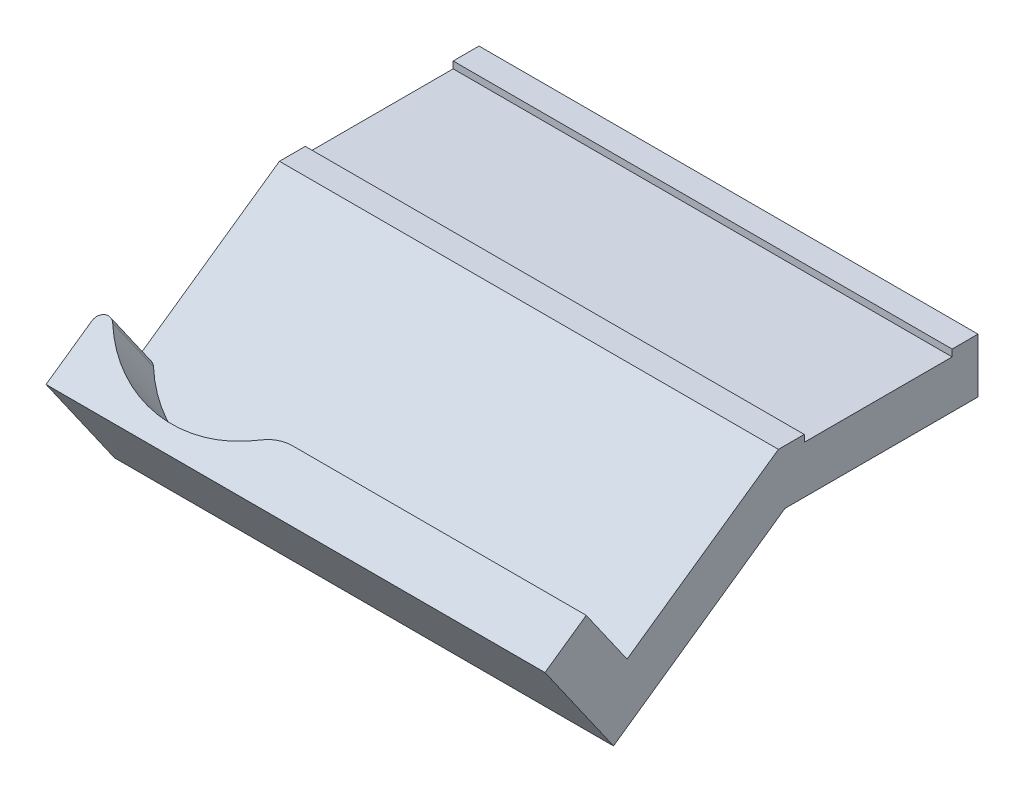
ISO-10303-21;
HEADER;
FILE_DESCRIPTION(('STEP AP214'),'2;1');
FILE_NAME('part.step','',(''),(''),'','','');
FILE_SCHEMA(('AUTOMOTIVE_DESIGN { 1 0 10303 214 1 1 1 1 }'));
ENDSEC;
DATA;
#1=APPLICATION_CONTEXT('core data for automotive mechanical design processes');
#2=APPLICATION_PROTOCOL_DEFINITION('international standard','automotive_design',2000,#1);
#3=PRODUCT_CONTEXT('',#1,'mechanical');
#4=PRODUCT('Part','Part','',(#3));
#5=PRODUCT_RELATED_PRODUCT_CATEGORY('part','',(#4));
#6=PRODUCT_DEFINITION_FORMATION('','',#4);
#7=PRODUCT_DEFINITION_CONTEXT('part definition',#1,'design');
#8=PRODUCT_DEFINITION('design','',#6,#7);
#9=PRODUCT_DEFINITION_SHAPE('','',#8);
#10=(LENGTH_UNIT() NAMED_UNIT(*) SI_UNIT(.MILLI.,.METRE.));
#11=(NAMED_UNIT(*) PLANE_ANGLE_UNIT() SI_UNIT($,.RADIAN.));
#12=(NAMED_UNIT(*) SI_UNIT($,.STERADIAN.) SOLID_ANGLE_UNIT());
#13=UNCERTAINTY_MEASURE_WITH_UNIT(LENGTH_MEASURE(1.E-05),#10,'distance_accuracy_value','');
#14=(GEOMETRIC_REPRESENTATION_CONTEXT(3) GLOBAL_UNCERTAINTY_ASSIGNED_CONTEXT((#13)) GLOBAL_UNIT_ASSIGNED_CONTEXT((#10,
#11,#12)) REPRESENTATION_CONTEXT('',''));
#15=CARTESIAN_POINT('',(0.,0.,0.));
#16=DIRECTION('',(0.,0.,1.));
#17=DIRECTION('',(1.,0.,0.));
#18=AXIS2_PLACEMENT_3D('',#15,#16,#17);
#19=CARTESIAN_POINT('',(55.,22.2536319186698,-46.5));
#20=DIRECTION('',(0.,-1.,0.));
#21=DIRECTION('',(0.,0.,-1.));
#22=AXIS2_PLACEMENT_3D('',#19,#20,#21);
#23=PLANE('',#22);
#24=DIRECTION('',(0.,0.,1.));
#25=VECTOR('',#24,1.);
#26=CARTESIAN_POINT('',(0.,22.2536319186698,-46.5));
#27=LINE('',#26,#25);
#28=CARTESIAN_POINT('',(0.,22.2536319186698,-46.5));
#29=VERTEX_POINT('',#28);
#30=CARTESIAN_POINT('',(0.,22.2536319186698,-43.65));
#31=VERTEX_POINT('',#30);
#32=EDGE_CURVE('E217',#29,#31,#27,.T.);
#33=ORIENTED_EDGE('',*,*,#32,.T.);
#34=DIRECTION('',(-1.,0.,0.));
#35=VECTOR('',#34,1.);
#36=CARTESIAN_POINT('',(0.,22.2536319186698,-43.65));
#37=LINE('',#36,#35);
#38=CARTESIAN_POINT('',(55.,22.2536319186698,-43.65));
#39=VERTEX_POINT('',#38);
#40=EDGE_CURVE('E181',#39,#31,#37,.T.);
#41=ORIENTED_EDGE('',*,*,#40,.F.);
#42=DIRECTION('',(0.,0.,1.));
#43=VECTOR('',#42,1.);
#44=CARTESIAN_POINT('',(55.,22.2536319186698,-46.5));
#45=LINE('',#44,#43);
#46=CARTESIAN_POINT('',(55.,22.2536319186698,-46.5));
#47=VERTEX_POINT('',#46);
#48=EDGE_CURVE('E213',#47,#39,#45,.T.);
#49=ORIENTED_EDGE('',*,*,#48,.F.);
#50=DIRECTION('',(1.,0.,0.));
#51=VECTOR('',#50,1.);
#52=CARTESIAN_POINT('',(55.,22.2536319186698,-46.5));
#53=LINE('',#52,#51);
#54=EDGE_CURVE('E210',#29,#47,#53,.T.);
#55=ORIENTED_EDGE('',*,*,#54,.F.);
#56=EDGE_LOOP('',(#33,#41,#49,#55));
#57=FACE_BOUND('',#56,.T.);
#58=ADVANCED_FACE('F35',(#57),#23,.F.);
#59=CARTESIAN_POINT('',(0.,50.,-29.));
#60=DIRECTION('',(1.,0.,0.));
#61=DIRECTION('',(0.,0.,-1.));
#62=AXIS2_PLACEMENT_3D('',#59,#60,#61);
#63=PLANE('',#62);
#64=DIRECTION('',(0.,0.,1.));
#65=VECTOR('',#64,1.);
#66=CARTESIAN_POINT('',(0.,21.5036319186698,-43.65));
#67=LINE('',#66,#65);
#68=CARTESIAN_POINT('',(0.,21.5036319186698,-43.65));
#69=VERTEX_POINT('',#68);
#70=CARTESIAN_POINT('',(0.,21.5036319186698,-27.35));
#71=VERTEX_POINT('',#70);
#72=EDGE_CURVE('E177',#69,#71,#67,.T.);
#73=ORIENTED_EDGE('',*,*,#72,.F.);
#74=DIRECTION('',(0.,1.,0.));
#75=VECTOR('',#74,1.);
#76=CARTESIAN_POINT('',(0.,21.5036319186698,-43.65));
#77=LINE('',#76,#75);
#78=EDGE_CURVE('E191',#69,#31,#77,.T.);
#79=ORIENTED_EDGE('',*,*,#78,.T.);
#80=ORIENTED_EDGE('',*,*,#32,.F.);
#81=DIRECTION('',(0.,1.,0.));
#82=VECTOR('',#81,1.);
#83=CARTESIAN_POINT('',(0.,22.2536319186698,-46.5));
#84=LINE('',#83,#82);
#85=CARTESIAN_POINT('',(0.,16.2536319186698,-46.5));
#86=VERTEX_POINT('',#85);
#87=EDGE_CURVE('E208',#86,#29,#84,.T.);
#88=ORIENTED_EDGE('',*,*,#87,.F.);
#89=DIRECTION('',(0.,0.,1.));
#90=VECTOR('',#89,1.);
#91=CARTESIAN_POINT('',(0.,16.2536319186698,-46.5));
#92=LINE('',#91,#90);
#93=CARTESIAN_POINT('',(0.,16.2536319186698,-25.2140740033711));
#94=VERTEX_POINT('',#93);
#95=EDGE_CURVE('E220',#86,#94,#92,.T.);
#96=ORIENTED_EDGE('',*,*,#95,.T.);
#97=DIRECTION('',(0.,-0.573576436351042,0.819152044288995));
#98=VECTOR('',#97,1.);
#99=CARTESIAN_POINT('',(0.,15.7536319186698,-24.5));
#100=LINE('',#99,#98);
#101=CARTESIAN_POINT('',(0.,3.02755103414073,-6.32527295112069));
#102=VERTEX_POINT('',#101);
#103=EDGE_CURVE('E221',#94,#102,#100,.T.);
#104=ORIENTED_EDGE('',*,*,#103,.T.);
#105=DIRECTION('',(0.,0.819152044288995,0.573576436351042));
#106=VECTOR('',#105,1.);
#107=CARTESIAN_POINT('',(0.,13.8157825302888,1.22872806643351));
#108=LINE('',#107,#106);
#109=CARTESIAN_POINT('',(0.,13.8157825302888,1.2287280664335));
#110=VERTEX_POINT('',#109);
#111=EDGE_CURVE('E173',#102,#110,#108,.T.);
#112=ORIENTED_EDGE('',*,*,#111,.T.);
#113=DIRECTION('',(0.,0.573576436351042,-0.819152044288995));
#114=VECTOR('',#113,1.);
#115=CARTESIAN_POINT('',(0.,10.6909016668292,5.69152044288994));
#116=LINE('',#115,#114);
#117=CARTESIAN_POINT('',(0.,17.3566866817596,-3.82820713955445));
#118=VERTEX_POINT('',#117);
#119=EDGE_CURVE('E156',#110,#118,#116,.T.);
#120=ORIENTED_EDGE('',*,*,#119,.T.);
#121=DIRECTION('',(0.,0.819152044288995,0.573576436351042));
#122=VECTOR('',#121,1.);
#123=CARTESIAN_POINT('',(0.,10.93002065142,-8.32820713955444));
#124=LINE('',#123,#122);
#125=CARTESIAN_POINT('',(0.,10.93002065142,-8.32820713955444));
#126=VERTEX_POINT('',#125);
#127=EDGE_CURVE('E248',#118,#126,#124,.F.);
#128=ORIENTED_EDGE('',*,*,#127,.T.);
#129=DIRECTION('',(0.,-0.573576436351042,0.819152044288995));
#130=VECTOR('',#129,1.);
#131=CARTESIAN_POINT('',(0.,33.4962159621314,-40.5560739923006));
#132=LINE('',#131,#130);
#133=CARTESIAN_POINT('',(0.,22.2536319186698,-24.5));
#134=VERTEX_POINT('',#133);
#135=EDGE_CURVE('E231',#134,#126,#132,.T.);
#136=ORIENTED_EDGE('',*,*,#135,.F.);
#137=CARTESIAN_POINT('',(0.,22.2536319186698,-27.35));
#138=VERTEX_POINT('',#137);
#139=EDGE_CURVE('E216',#138,#134,#27,.T.);
#140=ORIENTED_EDGE('',*,*,#139,.F.);
#141=DIRECTION('',(0.,1.,0.));
#142=VECTOR('',#141,1.);
#143=CARTESIAN_POINT('',(0.,21.5036319186698,-27.35));
#144=LINE('',#143,#142);
#145=EDGE_CURVE('E52',#71,#138,#144,.T.);
#146=ORIENTED_EDGE('',*,*,#145,.F.);
#147=EDGE_LOOP('',(#73,#79,#80,#88,#96,#104,#112,#120,#128,#136,#140,#146));
#148=FACE_BOUND('',#147,.T.);
#149=ADVANCED_FACE('F273',(#148),#63,.F.);
#150=CARTESIAN_POINT('',(55.,50.,-29.));
#151=DIRECTION('',(1.,0.,0.));
#152=DIRECTION('',(0.,0.,-1.));
#153=AXIS2_PLACEMENT_3D('',#150,#151,#152);
#154=PLANE('',#153);
#155=DIRECTION('',(0.,1.,0.));
#156=VECTOR('',#155,1.);
#157=CARTESIAN_POINT('',(55.,21.5036319186698,-43.65));
#158=LINE('',#157,#156);
#159=CARTESIAN_POINT('',(55.,21.5036319186698,-43.65));
#160=VERTEX_POINT('',#159);
#161=EDGE_CURVE('E195',#160,#39,#158,.T.);
#162=ORIENTED_EDGE('',*,*,#161,.F.);
#163=DIRECTION('',(0.,0.,-1.));
#164=VECTOR('',#163,1.);
#165=CARTESIAN_POINT('',(55.,21.5036319186698,-43.65));
#166=LINE('',#165,#164);
#167=CARTESIAN_POINT('',(55.,21.5036319186698,-27.35));
#168=VERTEX_POINT('',#167);
#169=EDGE_CURVE('E184',#168,#160,#166,.T.);
#170=ORIENTED_EDGE('',*,*,#169,.F.);
#171=DIRECTION('',(0.,1.,0.));
#172=VECTOR('',#171,1.);
#173=CARTESIAN_POINT('',(55.,21.5036319186698,-27.35));
#174=LINE('',#173,#172);
#175=CARTESIAN_POINT('',(55.,22.2536319186698,-27.35));
#176=VERTEX_POINT('',#175);
#177=EDGE_CURVE('E197',#168,#176,#174,.T.);
#178=ORIENTED_EDGE('',*,*,#177,.T.);
#179=CARTESIAN_POINT('',(55.,22.2536319186698,-24.5));
#180=VERTEX_POINT('',#179);
#181=EDGE_CURVE('E212',#176,#180,#45,.T.);
#182=ORIENTED_EDGE('',*,*,#181,.T.);
#183=DIRECTION('',(0.,0.573576436351041,-0.819152044288995));
#184=VECTOR('',#183,1.);
#185=CARTESIAN_POINT('',(55.,10.,-7.));
#186=LINE('',#185,#184);
#187=CARTESIAN_POINT('',(55.,10.573576436351,-7.819152044289));
#188=VERTEX_POINT('',#187);
#189=EDGE_CURVE('E239',#188,#180,#186,.T.);
#190=ORIENTED_EDGE('',*,*,#189,.F.);
#191=DIRECTION('',(0.,0.819152044288995,0.573576436351042));
#192=VECTOR('',#191,1.);
#193=CARTESIAN_POINT('',(55.,10.573576436351,-7.819152044289));
#194=LINE('',#193,#192);
#195=CARTESIAN_POINT('',(55.,17.0002424666906,-3.31915204428899));
#196=VERTEX_POINT('',#195);
#197=EDGE_CURVE('E153',#188,#196,#194,.T.);
#198=ORIENTED_EDGE('',*,*,#197,.T.);
#199=DIRECTION('',(0.,0.573576436351042,-0.819152044288995));
#200=VECTOR('',#199,1.);
#201=CARTESIAN_POINT('',(55.,10.6909016668292,5.69152044288994));
#202=LINE('',#201,#200);
#203=CARTESIAN_POINT('',(55.,13.8157825302888,1.22872806643349));
#204=VERTEX_POINT('',#203);
#205=EDGE_CURVE('E145',#204,#196,#202,.T.);
#206=ORIENTED_EDGE('',*,*,#205,.F.);
#207=DIRECTION('',(0.,-0.819152044288995,-0.573576436351042));
#208=VECTOR('',#207,1.);
#209=CARTESIAN_POINT('',(55.,13.8157825302888,1.22872806643349));
#210=LINE('',#209,#208);
#211=CARTESIAN_POINT('',(55.,3.02755103414073,-6.3252729511207));
#212=VERTEX_POINT('',#211);
#213=EDGE_CURVE('E150',#204,#212,#210,.T.);
#214=ORIENTED_EDGE('',*,*,#213,.T.);
#215=DIRECTION('',(0.,-0.573576436351042,0.819152044288995));
#216=VECTOR('',#215,1.);
#217=CARTESIAN_POINT('',(55.,15.7536319186698,-24.5));
#218=LINE('',#217,#216);
#219=CARTESIAN_POINT('',(55.,16.2536319186698,-25.2140740033711));
#220=VERTEX_POINT('',#219);
#221=EDGE_CURVE('E224',#220,#212,#218,.T.);
#222=ORIENTED_EDGE('',*,*,#221,.F.);
#223=DIRECTION('',(0.,0.,1.));
#224=VECTOR('',#223,1.);
#225=CARTESIAN_POINT('',(55.,16.2536319186698,-46.5));
#226=LINE('',#225,#224);
#227=CARTESIAN_POINT('',(55.,16.2536319186698,-46.5));
#228=VERTEX_POINT('',#227);
#229=EDGE_CURVE('E226',#228,#220,#226,.T.);
#230=ORIENTED_EDGE('',*,*,#229,.F.);
#231=DIRECTION('',(0.,-1.,0.));
#232=VECTOR('',#231,1.);
#233=CARTESIAN_POINT('',(55.,22.2536319186698,-46.5));
#234=LINE('',#233,#232);
#235=EDGE_CURVE('E203',#47,#228,#234,.T.);
#236=ORIENTED_EDGE('',*,*,#235,.F.);
#237=ORIENTED_EDGE('',*,*,#48,.T.);
#238=EDGE_LOOP('',(#162,#170,#178,#182,#190,#198,#206,#214,#222,#230,#236,#237));
#239=FACE_BOUND('',#238,.T.);
#240=ADVANCED_FACE('F148',(#239),#154,.T.);
#241=CARTESIAN_POINT('',(5.,10.,-7.));
#242=DIRECTION('',(0.,-0.819152044288995,-0.573576436351041));
#243=DIRECTION('',(0.,0.573576436351041,-0.819152044288995));
#244=AXIS2_PLACEMENT_3D('',#241,#242,#243);
#245=PLANE('',#244);
#246=ORIENTED_EDGE('',*,*,#189,.T.);
#247=DIRECTION('',(1.,0.,0.));
#248=VECTOR('',#247,1.);
#249=CARTESIAN_POINT('',(0.,22.2536319186698,-24.5));
#250=LINE('',#249,#248);
#251=EDGE_CURVE('E223',#134,#180,#250,.T.);
#252=ORIENTED_EDGE('',*,*,#251,.F.);
#253=ORIENTED_EDGE('',*,*,#135,.T.);
#254=CARTESIAN_POINT('',(1.,10.93002065142,-8.32820713955445));
#255=DIRECTION('',(0.,-0.819152044288995,-0.573576436351041));
#256=DIRECTION('',(0.,0.573576436351041,-0.819152044288995));
#257=AXIS2_PLACEMENT_3D('',#254,#255,#256);
#258=CIRCLE('',#257,1.);
#259=CARTESIAN_POINT('',(1.7457627118644,11.3121439619383,-8.87393578380095));
#260=VERTEX_POINT('',#259);
#261=EDGE_CURVE('E251',#126,#260,#258,.T.);
#262=ORIENTED_EDGE('',*,*,#261,.T.);
#263=CARTESIAN_POINT('',(12.,16.5663394815659,-16.3777046421904));
#264=DIRECTION('',(0.,0.819152044288995,0.573576436351042));
#265=DIRECTION('',(0.,-0.573576436351042,0.819152044288995));
#266=AXIS2_PLACEMENT_3D('',#263,#264,#265);
#267=CIRCLE('',#266,13.75);
#268=CARTESIAN_POINT('',(19.7926745718327,10.0685329817878,-7.0978752413364));
#269=VERTEX_POINT('',#268);
#270=EDGE_CURVE('E229',#260,#269,#267,.T.);
#271=ORIENTED_EDGE('',*,*,#270,.T.);
#272=CARTESIAN_POINT('',(22.6263744161355,7.70569425459584,-3.72339182284403));
#273=DIRECTION('',(0.,-0.819152044288995,-0.573576436351041));
#274=DIRECTION('',(0.,0.573576436351041,-0.819152044288995));
#275=AXIS2_PLACEMENT_3D('',#272,#273,#274);
#276=CIRCLE('',#275,5.);
#277=CARTESIAN_POINT('',(22.6263744161355,10.573576436351,-7.819152044289));
#278=VERTEX_POINT('',#277);
#279=EDGE_CURVE('E11',#269,#278,#276,.T.);
#280=ORIENTED_EDGE('',*,*,#279,.T.);
#281=DIRECTION('',(1.,0.,0.));
#282=VECTOR('',#281,1.);
#283=CARTESIAN_POINT('',(0.,10.573576436351,-7.819152044289));
#284=LINE('',#283,#282);
#285=EDGE_CURVE('E236',#278,#188,#284,.T.);
#286=ORIENTED_EDGE('',*,*,#285,.T.);
#287=EDGE_LOOP('',(#246,#252,#253,#262,#271,#280,#286));
#288=FACE_BOUND('',#287,.T.);
#289=ADVANCED_FACE('F295',(#288),#245,.F.);
#290=CARTESIAN_POINT('',(0.,10.573576436351,-7.819152044289));
#291=DIRECTION('',(0.,0.573576436351042,-0.819152044288995));
#292=DIRECTION('',(0.,0.819152044288995,0.573576436351042));
#293=AXIS2_PLACEMENT_3D('',#290,#291,#292);
#294=PLANE('',#293);
#295=ORIENTED_EDGE('',*,*,#285,.F.);
#296=DIRECTION('',(0.,-0.819152044288995,-0.573576436351042));
#297=VECTOR('',#296,1.);
#298=CARTESIAN_POINT('',(22.6263744161355,10.573576436351,-7.819152044289));
#299=LINE('',#298,#297);
#300=CARTESIAN_POINT('',(22.6263744161355,17.0002424666906,-3.31915204428899));
#301=VERTEX_POINT('',#300);
#302=EDGE_CURVE('E253',#278,#301,#299,.F.);
#303=ORIENTED_EDGE('',*,*,#302,.T.);
#304=DIRECTION('',(1.,0.,0.));
#305=VECTOR('',#304,1.);
#306=CARTESIAN_POINT('',(0.,17.0002424666906,-3.31915204428899));
#307=LINE('',#306,#305);
#308=EDGE_CURVE('E157',#301,#196,#307,.T.);
#309=ORIENTED_EDGE('',*,*,#308,.T.);
#310=ORIENTED_EDGE('',*,*,#197,.F.);
#311=EDGE_LOOP('',(#295,#303,#309,#310));
#312=FACE_BOUND('',#311,.T.);
#313=ADVANCED_FACE('F298',(#312),#294,.T.);
#314=CARTESIAN_POINT('',(0.,10.6909016668292,5.69152044288994));
#315=DIRECTION('',(0.,-0.819152044288995,-0.573576436351042));
#316=DIRECTION('',(0.,0.573576436351042,-0.819152044288995));
#317=AXIS2_PLACEMENT_3D('',#314,#315,#316);
#318=PLANE('',#317);
#319=ORIENTED_EDGE('',*,*,#308,.F.);
#320=CARTESIAN_POINT('',(22.6263744161355,14.1323602849354,0.776608177155975));
#321=DIRECTION('',(0.,-0.819152044288995,-0.573576436351042));
#322=DIRECTION('',(0.,0.573576436351042,-0.819152044288995));
#323=AXIS2_PLACEMENT_3D('',#320,#321,#322);
#324=CIRCLE('',#323,5.);
#325=CARTESIAN_POINT('',(19.7926745718327,16.4951990121274,-2.5978752413364));
#326=VERTEX_POINT('',#325);
#327=EDGE_CURVE('E256',#301,#326,#324,.F.);
#328=ORIENTED_EDGE('',*,*,#327,.T.);
#329=CARTESIAN_POINT('',(12.,22.9930055119054,-11.8777046421904));
#330=DIRECTION('',(0.,-0.819152044288995,-0.573576436351042));
#331=DIRECTION('',(0.,0.573576436351042,-0.819152044288995));
#332=AXIS2_PLACEMENT_3D('',#329,#330,#331);
#333=CIRCLE('',#332,13.75);
#334=CARTESIAN_POINT('',(1.74576271186441,17.7388099922779,-4.37393578380095));
#335=VERTEX_POINT('',#334);
#336=EDGE_CURVE('E233',#335,#326,#333,.F.);
#337=ORIENTED_EDGE('',*,*,#336,.F.);
#338=CARTESIAN_POINT('',(1.,17.3566866817596,-3.82820713955445));
#339=DIRECTION('',(0.,-0.819152044288995,-0.573576436351042));
#340=DIRECTION('',(0.,0.573576436351042,-0.819152044288995));
#341=AXIS2_PLACEMENT_3D('',#338,#339,#340);
#342=CIRCLE('',#341,1.);
#343=EDGE_CURVE('E246',#335,#118,#342,.F.);
#344=ORIENTED_EDGE('',*,*,#343,.T.);
#345=ORIENTED_EDGE('',*,*,#119,.F.);
#346=DIRECTION('',(1.,0.,0.));
#347=VECTOR('',#346,1.);
#348=CARTESIAN_POINT('',(-14.5885613562213,13.8157825302888,1.22872806643351));
#349=LINE('',#348,#347);
#350=EDGE_CURVE('E160',#110,#204,#349,.T.);
#351=ORIENTED_EDGE('',*,*,#350,.T.);
#352=ORIENTED_EDGE('',*,*,#205,.T.);
#353=EDGE_LOOP('',(#319,#328,#337,#344,#345,#351,#352));
#354=FACE_BOUND('',#353,.T.);
#355=ADVANCED_FACE('F161',(#354),#318,.F.);
#356=CARTESIAN_POINT('',(12.,46.6956665208301,4.7190772718878));
#357=DIRECTION('',(0.,-0.819152044288995,-0.573576436351042));
#358=DIRECTION('',(0.,0.573576436351042,-0.819152044288995));
#359=AXIS2_PLACEMENT_3D('',#356,#357,#358);
#360=CYLINDRICAL_SURFACE('',#359,13.75);
#361=ORIENTED_EDGE('',*,*,#336,.T.);
#362=DIRECTION('',(0.,-0.819152044288995,-0.573576436351042));
#363=VECTOR('',#362,1.);
#364=CARTESIAN_POINT('',(19.7926745718327,40.1978600210521,13.9989066727418));
#365=LINE('',#364,#363);
#366=EDGE_CURVE('E44',#326,#269,#365,.T.);
#367=ORIENTED_EDGE('',*,*,#366,.T.);
#368=ORIENTED_EDGE('',*,*,#270,.F.);
#369=DIRECTION('',(0.,-0.819152044288995,-0.573576436351042));
#370=VECTOR('',#369,1.);
#371=CARTESIAN_POINT('',(1.74576271186441,41.4414710012026,12.2228461302773));
#372=LINE('',#371,#370);
#373=EDGE_CURVE('E243',#260,#335,#372,.F.);
#374=ORIENTED_EDGE('',*,*,#373,.T.);
#375=EDGE_LOOP('',(#361,#367,#368,#374));
#376=FACE_BOUND('',#375,.T.);
#377=ADVANCED_FACE('F302',(#376),#360,.F.);
#378=CARTESIAN_POINT('',(1.,41.0593476906842,12.7685747745238));
#379=DIRECTION('',(0.,-0.819152044288995,-0.573576436351042));
#380=DIRECTION('',(0.,0.573576436351042,-0.819152044288995));
#381=AXIS2_PLACEMENT_3D('',#378,#379,#380);
#382=CYLINDRICAL_SURFACE('',#381,1.);
#383=ORIENTED_EDGE('',*,*,#261,.F.);
#384=ORIENTED_EDGE('',*,*,#127,.F.);
#385=ORIENTED_EDGE('',*,*,#343,.F.);
#386=ORIENTED_EDGE('',*,*,#373,.F.);
#387=EDGE_LOOP('',(#383,#384,#385,#386));
#388=FACE_BOUND('',#387,.T.);
#389=ADVANCED_FACE('F307',(#388),#382,.T.);
#390=CARTESIAN_POINT('',(22.6263744161355,37.8350212938601,17.3733900912342));
#391=DIRECTION('',(0.,-0.819152044288995,-0.573576436351042));
#392=DIRECTION('',(0.,0.573576436351042,-0.819152044288995));
#393=AXIS2_PLACEMENT_3D('',#390,#391,#392);
#394=CYLINDRICAL_SURFACE('',#393,5.);
#395=ORIENTED_EDGE('',*,*,#279,.F.);
#396=ORIENTED_EDGE('',*,*,#366,.F.);
#397=ORIENTED_EDGE('',*,*,#327,.F.);
#398=ORIENTED_EDGE('',*,*,#302,.F.);
#399=EDGE_LOOP('',(#395,#396,#397,#398));
#400=FACE_BOUND('',#399,.T.);
#401=ADVANCED_FACE('F37',(#400),#394,.T.);
#402=CARTESIAN_POINT('',(0.,15.7536319186698,-24.5));
#403=DIRECTION('',(0.,0.819152044288995,0.573576436351042));
#404=DIRECTION('',(0.,-0.573576436351042,0.819152044288995));
#405=AXIS2_PLACEMENT_3D('',#402,#403,#404);
#406=PLANE('',#405);
#407=ORIENTED_EDGE('',*,*,#221,.T.);
#408=DIRECTION('',(1.,0.,0.));
#409=VECTOR('',#408,1.);
#410=CARTESIAN_POINT('',(-14.5885613562213,3.02755103414073,-6.32527295112069));
#411=LINE('',#410,#409);
#412=EDGE_CURVE('E166',#102,#212,#411,.T.);
#413=ORIENTED_EDGE('',*,*,#412,.F.);
#414=ORIENTED_EDGE('',*,*,#103,.F.);
#415=DIRECTION('',(-1.,0.,0.));
#416=VECTOR('',#415,1.);
#417=CARTESIAN_POINT('',(55.,16.2536319186698,-25.2140740033711));
#418=LINE('',#417,#416);
#419=EDGE_CURVE('E194',#220,#94,#418,.T.);
#420=ORIENTED_EDGE('',*,*,#419,.F.);
#421=EDGE_LOOP('',(#407,#413,#414,#420));
#422=FACE_BOUND('',#421,.T.);
#423=ADVANCED_FACE('F270',(#422),#406,.F.);
#424=CARTESIAN_POINT('',(55.,16.2536319186698,-46.5));
#425=DIRECTION('',(0.,1.,0.));
#426=DIRECTION('',(0.,0.,1.));
#427=AXIS2_PLACEMENT_3D('',#424,#425,#426);
#428=PLANE('',#427);
#429=ORIENTED_EDGE('',*,*,#229,.T.);
#430=ORIENTED_EDGE('',*,*,#419,.T.);
#431=ORIENTED_EDGE('',*,*,#95,.F.);
#432=DIRECTION('',(-1.,0.,0.));
#433=VECTOR('',#432,1.);
#434=CARTESIAN_POINT('',(55.,16.2536319186698,-46.5));
#435=LINE('',#434,#433);
#436=EDGE_CURVE('E206',#228,#86,#435,.T.);
#437=ORIENTED_EDGE('',*,*,#436,.F.);
#438=EDGE_LOOP('',(#429,#430,#431,#437));
#439=FACE_BOUND('',#438,.T.);
#440=ADVANCED_FACE('F265',(#439),#428,.F.);
#441=ORIENTED_EDGE('',*,*,#181,.F.);
#442=DIRECTION('',(1.,0.,0.));
#443=VECTOR('',#442,1.);
#444=CARTESIAN_POINT('',(0.,22.2536319186698,-27.35));
#445=LINE('',#444,#443);
#446=EDGE_CURVE('E176',#138,#176,#445,.T.);
#447=ORIENTED_EDGE('',*,*,#446,.F.);
#448=ORIENTED_EDGE('',*,*,#139,.T.);
#449=ORIENTED_EDGE('',*,*,#251,.T.);
#450=EDGE_LOOP('',(#441,#447,#448,#449));
#451=FACE_BOUND('',#450,.T.);
#452=ADVANCED_FACE('F293',(#451),#23,.F.);
#453=CARTESIAN_POINT('',(0.,0.,-46.5));
#454=DIRECTION('',(0.,0.,-1.));
#455=DIRECTION('',(-1.,0.,0.));
#456=AXIS2_PLACEMENT_3D('',#453,#454,#455);
#457=PLANE('',#456);
#458=ORIENTED_EDGE('',*,*,#235,.T.);
#459=ORIENTED_EDGE('',*,*,#436,.T.);
#460=ORIENTED_EDGE('',*,*,#87,.T.);
#461=ORIENTED_EDGE('',*,*,#54,.T.);
#462=EDGE_LOOP('',(#458,#459,#460,#461));
#463=FACE_BOUND('',#462,.T.);
#464=ADVANCED_FACE('F278',(#463),#457,.T.);
#465=CARTESIAN_POINT('',(0.,21.5036319186698,-43.65));
#466=DIRECTION('',(0.,0.,-1.));
#467=DIRECTION('',(-1.,0.,0.));
#468=AXIS2_PLACEMENT_3D('',#465,#466,#467);
#469=PLANE('',#468);
#470=ORIENTED_EDGE('',*,*,#40,.T.);
#471=ORIENTED_EDGE('',*,*,#78,.F.);
#472=DIRECTION('',(-1.,0.,0.));
#473=VECTOR('',#472,1.);
#474=CARTESIAN_POINT('',(0.,21.5036319186698,-43.65));
#475=LINE('',#474,#473);
#476=EDGE_CURVE('E186',#160,#69,#475,.T.);
#477=ORIENTED_EDGE('',*,*,#476,.F.);
#478=ORIENTED_EDGE('',*,*,#161,.T.);
#479=EDGE_LOOP('',(#470,#471,#477,#478));
#480=FACE_BOUND('',#479,.T.);
#481=ADVANCED_FACE('F285',(#480),#469,.F.);
#482=CARTESIAN_POINT('',(0.,21.5036319186698,-27.35));
#483=DIRECTION('',(0.,0.,1.));
#484=DIRECTION('',(1.,0.,0.));
#485=AXIS2_PLACEMENT_3D('',#482,#483,#484);
#486=PLANE('',#485);
#487=ORIENTED_EDGE('',*,*,#446,.T.);
#488=ORIENTED_EDGE('',*,*,#177,.F.);
#489=DIRECTION('',(1.,0.,0.));
#490=VECTOR('',#489,1.);
#491=CARTESIAN_POINT('',(0.,21.5036319186698,-27.35));
#492=LINE('',#491,#490);
#493=EDGE_CURVE('E180',#71,#168,#492,.T.);
#494=ORIENTED_EDGE('',*,*,#493,.F.);
#495=ORIENTED_EDGE('',*,*,#145,.T.);
#496=EDGE_LOOP('',(#487,#488,#494,#495));
#497=FACE_BOUND('',#496,.T.);
#498=ADVANCED_FACE('F386',(#497),#486,.F.);
#499=CARTESIAN_POINT('',(0.,21.5036319186698,0.));
#500=DIRECTION('',(0.,1.,0.));
#501=DIRECTION('',(0.,0.,1.));
#502=AXIS2_PLACEMENT_3D('',#499,#500,#501);
#503=PLANE('',#502);
#504=ORIENTED_EDGE('',*,*,#72,.T.);
#505=ORIENTED_EDGE('',*,*,#493,.T.);
#506=ORIENTED_EDGE('',*,*,#169,.T.);
#507=ORIENTED_EDGE('',*,*,#476,.T.);
#508=EDGE_LOOP('',(#504,#505,#506,#507));
#509=FACE_BOUND('',#508,.T.);
#510=ADVANCED_FACE('F287',(#509),#503,.T.);
#511=CARTESIAN_POINT('',(-14.5885613562213,13.8157825302888,1.22872806643351));
#512=DIRECTION('',(0.,-0.573576436351042,0.819152044288995));
#513=DIRECTION('',(0.,-0.819152044288995,-0.573576436351042));
#514=AXIS2_PLACEMENT_3D('',#511,#512,#513);
#515=PLANE('',#514);
#516=ORIENTED_EDGE('',*,*,#111,.F.);
#517=ORIENTED_EDGE('',*,*,#412,.T.);
#518=ORIENTED_EDGE('',*,*,#213,.F.);
#519=ORIENTED_EDGE('',*,*,#350,.F.);
#520=EDGE_LOOP('',(#516,#517,#518,#519));
#521=FACE_BOUND('',#520,.T.);
#522=ADVANCED_FACE('F169',(#521),#515,.T.);
#523=CLOSED_SHELL('',(#58,#149,#240,#289,#313,#355,#377,#389,#401,#423,#440,#452,#464,#481,#498,
#510,#522));
#524=MANIFOLD_SOLID_BREP('B2',#523);
#525=ADVANCED_BREP_SHAPE_REPRESENTATION('',(#18,#524),#14);
#526=SHAPE_DEFINITION_REPRESENTATION(#9,#525);
ENDSEC;
END-ISO-10303-21;
